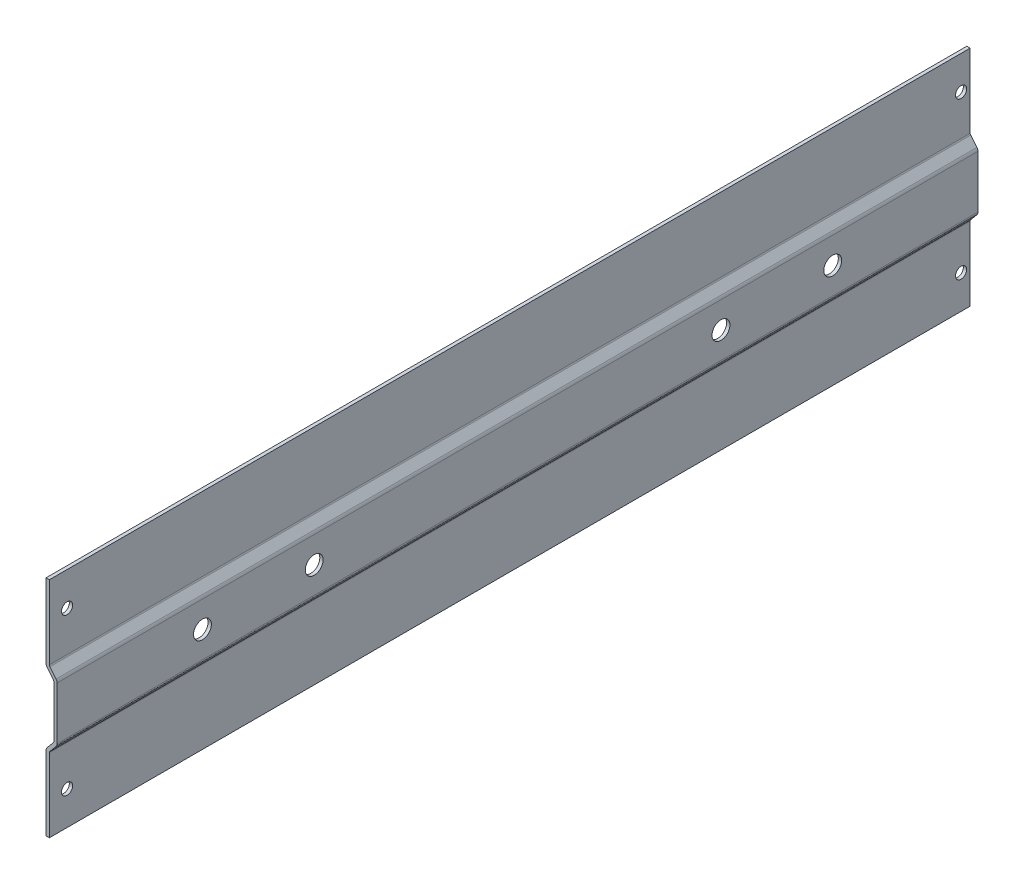
ISO-10303-21;
HEADER;
FILE_DESCRIPTION(('STEP AP214'),'2;1');
FILE_NAME('part.step','',(''),(''),'','','');
FILE_SCHEMA(('AUTOMOTIVE_DESIGN { 1 0 10303 214 1 1 1 1 }'));
ENDSEC;
DATA;
#1=APPLICATION_CONTEXT('core data for automotive mechanical design processes');
#2=APPLICATION_PROTOCOL_DEFINITION('international standard','automotive_design',2000,#1);
#3=PRODUCT_CONTEXT('',#1,'mechanical');
#4=PRODUCT('Part','Part','',(#3));
#5=PRODUCT_RELATED_PRODUCT_CATEGORY('part','',(#4));
#6=PRODUCT_DEFINITION_FORMATION('','',#4);
#7=PRODUCT_DEFINITION_CONTEXT('part definition',#1,'design');
#8=PRODUCT_DEFINITION('design','',#6,#7);
#9=PRODUCT_DEFINITION_SHAPE('','',#8);
#10=(LENGTH_UNIT() NAMED_UNIT(*) SI_UNIT(.MILLI.,.METRE.));
#11=(NAMED_UNIT(*) PLANE_ANGLE_UNIT() SI_UNIT($,.RADIAN.));
#12=(NAMED_UNIT(*) SI_UNIT($,.STERADIAN.) SOLID_ANGLE_UNIT());
#13=UNCERTAINTY_MEASURE_WITH_UNIT(LENGTH_MEASURE(1.E-05),#10,'distance_accuracy_value','');
#14=(GEOMETRIC_REPRESENTATION_CONTEXT(3) GLOBAL_UNCERTAINTY_ASSIGNED_CONTEXT((#13)) GLOBAL_UNIT_ASSIGNED_CONTEXT((#10,
#11,#12)) REPRESENTATION_CONTEXT('',''));
#15=CARTESIAN_POINT('',(0.,0.,0.));
#16=DIRECTION('',(0.,0.,1.));
#17=DIRECTION('',(1.,0.,0.));
#18=AXIS2_PLACEMENT_3D('',#15,#16,#17);
#19=CARTESIAN_POINT('',(3.,0.,824.));
#20=DIRECTION('',(0.,1.,0.));
#21=DIRECTION('',(0.,0.,1.));
#22=AXIS2_PLACEMENT_3D('',#19,#20,#21);
#23=PLANE('',#22);
#24=DIRECTION('',(1.,0.,0.));
#25=VECTOR('',#24,1.);
#26=CARTESIAN_POINT('',(3.,0.,0.));
#27=LINE('',#26,#25);
#28=CARTESIAN_POINT('',(0.,0.,0.));
#29=VERTEX_POINT('',#28);
#30=CARTESIAN_POINT('',(3.,0.,0.));
#31=VERTEX_POINT('',#30);
#32=EDGE_CURVE('E197',#29,#31,#27,.T.);
#33=ORIENTED_EDGE('',*,*,#32,.T.);
#34=DIRECTION('',(0.,0.,-1.));
#35=VECTOR('',#34,1.);
#36=CARTESIAN_POINT('',(3.,0.,824.));
#37=LINE('',#36,#35);
#38=CARTESIAN_POINT('',(3.,0.,824.));
#39=VERTEX_POINT('',#38);
#40=EDGE_CURVE('E177',#39,#31,#37,.T.);
#41=ORIENTED_EDGE('',*,*,#40,.F.);
#42=DIRECTION('',(1.,0.,0.));
#43=VECTOR('',#42,1.);
#44=CARTESIAN_POINT('',(3.,0.,824.));
#45=LINE('',#44,#43);
#46=CARTESIAN_POINT('',(0.,0.,824.));
#47=VERTEX_POINT('',#46);
#48=EDGE_CURVE('E184',#47,#39,#45,.T.);
#49=ORIENTED_EDGE('',*,*,#48,.F.);
#50=DIRECTION('',(0.,0.,-1.));
#51=VECTOR('',#50,1.);
#52=CARTESIAN_POINT('',(0.,0.,824.));
#53=LINE('',#52,#51);
#54=EDGE_CURVE('E316',#47,#29,#53,.T.);
#55=ORIENTED_EDGE('',*,*,#54,.T.);
#56=EDGE_LOOP('',(#33,#41,#49,#55));
#57=FACE_BOUND('',#56,.T.);
#58=ADVANCED_FACE('F35',(#57),#23,.F.);
#59=CARTESIAN_POINT('',(3.,66.6577248518405,824.));
#60=DIRECTION('',(-1.,0.,0.));
#61=DIRECTION('',(0.,-1.,0.));
#62=AXIS2_PLACEMENT_3D('',#59,#60,#61);
#63=PLANE('',#62);
#64=CARTESIAN_POINT('',(3.,30.,8.14000000000004));
#65=DIRECTION('',(-1.,0.,0.));
#66=DIRECTION('',(0.,-1.,0.));
#67=AXIS2_PLACEMENT_3D('',#64,#65,#66);
#68=CIRCLE('',#67,5.);
#69=CARTESIAN_POINT('',(3.,25.,8.14000000000004));
#70=VERTEX_POINT('',#69);
#71=EDGE_CURVE('E667',#70,#70,#68,.T.);
#72=ORIENTED_EDGE('',*,*,#71,.T.);
#73=EDGE_LOOP('',(#72));
#74=FACE_BOUND('',#73,.T.);
#75=CARTESIAN_POINT('',(3.,30.,808.14));
#76=DIRECTION('',(-1.,0.,0.));
#77=DIRECTION('',(0.,-1.,0.));
#78=AXIS2_PLACEMENT_3D('',#75,#76,#77);
#79=CIRCLE('',#78,5.);
#80=CARTESIAN_POINT('',(3.,25.,808.14));
#81=VERTEX_POINT('',#80);
#82=EDGE_CURVE('E682',#81,#81,#79,.T.);
#83=ORIENTED_EDGE('',*,*,#82,.T.);
#84=EDGE_LOOP('',(#83));
#85=FACE_BOUND('',#84,.T.);
#86=DIRECTION('',(0.,1.,0.));
#87=VECTOR('',#86,1.);
#88=CARTESIAN_POINT('',(3.,66.6577248518405,0.));
#89=LINE('',#88,#87);
#90=CARTESIAN_POINT('',(3.,65.9297843833081,0.));
#91=VERTEX_POINT('',#90);
#92=EDGE_CURVE('E287',#31,#91,#89,.T.);
#93=ORIENTED_EDGE('',*,*,#92,.T.);
#94=DIRECTION('',(0.,0.,-1.));
#95=VECTOR('',#94,1.);
#96=CARTESIAN_POINT('',(3.,65.9297843833081,824.));
#97=LINE('',#96,#95);
#98=CARTESIAN_POINT('',(3.,65.9297843833081,824.));
#99=VERTEX_POINT('',#98);
#100=EDGE_CURVE('E180',#91,#99,#97,.F.);
#101=ORIENTED_EDGE('',*,*,#100,.T.);
#102=DIRECTION('',(0.,1.,0.));
#103=VECTOR('',#102,1.);
#104=CARTESIAN_POINT('',(3.,66.6577248518405,824.));
#105=LINE('',#104,#103);
#106=EDGE_CURVE('E172',#39,#99,#105,.T.);
#107=ORIENTED_EDGE('',*,*,#106,.F.);
#108=ORIENTED_EDGE('',*,*,#40,.T.);
#109=EDGE_LOOP('',(#93,#101,#107,#108));
#110=FACE_BOUND('',#109,.T.);
#111=ADVANCED_FACE('F175',(#74,#85,#110),#63,.F.);
#112=CARTESIAN_POINT('',(10.,75.,824.));
#113=DIRECTION('',(-0.766044443118977,0.642787609686541,0.));
#114=DIRECTION('',(-0.642787609686541,-0.766044443118977,0.));
#115=AXIS2_PLACEMENT_3D('',#112,#113,#114);
#116=PLANE('',#115);
#117=DIRECTION('',(0.642787609686541,0.766044443118977,0.));
#118=VECTOR('',#117,1.);
#119=CARTESIAN_POINT('',(10.,75.,824.));
#120=LINE('',#119,#118);
#121=CARTESIAN_POINT('',(3.46791111376204,67.2153596026812,824.));
#122=VERTEX_POINT('',#121);
#123=CARTESIAN_POINT('',(9.06417777247592,73.8847304983186,824.));
#124=VERTEX_POINT('',#123);
#125=EDGE_CURVE('E183',#122,#124,#120,.T.);
#126=ORIENTED_EDGE('',*,*,#125,.F.);
#127=DIRECTION('',(0.,0.,-1.));
#128=VECTOR('',#127,1.);
#129=CARTESIAN_POINT('',(3.46791111376204,67.2153596026812,0.));
#130=LINE('',#129,#128);
#131=CARTESIAN_POINT('',(3.46791111376204,67.2153596026812,0.));
#132=VERTEX_POINT('',#131);
#133=EDGE_CURVE('E255',#122,#132,#130,.T.);
#134=ORIENTED_EDGE('',*,*,#133,.T.);
#135=DIRECTION('',(0.642787609686541,0.766044443118977,0.));
#136=VECTOR('',#135,1.);
#137=CARTESIAN_POINT('',(10.,75.,0.));
#138=LINE('',#137,#136);
#139=CARTESIAN_POINT('',(9.06417777247592,73.8847304983186,0.));
#140=VERTEX_POINT('',#139);
#141=EDGE_CURVE('E288',#132,#140,#138,.T.);
#142=ORIENTED_EDGE('',*,*,#141,.T.);
#143=DIRECTION('',(0.,0.,-1.));
#144=VECTOR('',#143,1.);
#145=CARTESIAN_POINT('',(9.06417777247592,73.8847304983186,824.));
#146=LINE('',#145,#144);
#147=EDGE_CURVE('E239',#140,#124,#146,.F.);
#148=ORIENTED_EDGE('',*,*,#147,.T.);
#149=EDGE_LOOP('',(#126,#134,#142,#148));
#150=FACE_BOUND('',#149,.T.);
#151=ADVANCED_FACE('F278',(#150),#116,.F.);
#152=CARTESIAN_POINT('',(10.,125.,824.));
#153=DIRECTION('',(-1.,0.,0.));
#154=DIRECTION('',(0.,-1.,0.));
#155=AXIS2_PLACEMENT_3D('',#152,#153,#154);
#156=PLANE('',#155);
#157=CARTESIAN_POINT('',(10.,100.,694.));
#158=DIRECTION('',(1.,0.,0.));
#159=DIRECTION('',(0.,0.,-1.));
#160=AXIS2_PLACEMENT_3D('',#157,#158,#159);
#161=CIRCLE('',#160,7.99999999999999);
#162=CARTESIAN_POINT('',(10.,100.,686.));
#163=VERTEX_POINT('',#162);
#164=EDGE_CURVE('E685',#163,#163,#161,.T.);
#165=ORIENTED_EDGE('',*,*,#164,.F.);
#166=EDGE_LOOP('',(#165));
#167=FACE_BOUND('',#166,.T.);
#168=CARTESIAN_POINT('',(10.,100.,130.));
#169=DIRECTION('',(1.,0.,0.));
#170=DIRECTION('',(0.,0.,-1.));
#171=AXIS2_PLACEMENT_3D('',#168,#169,#170);
#172=CIRCLE('',#171,7.99999999999999);
#173=CARTESIAN_POINT('',(10.,100.,122.));
#174=VERTEX_POINT('',#173);
#175=EDGE_CURVE('E691',#174,#174,#172,.T.);
#176=ORIENTED_EDGE('',*,*,#175,.F.);
#177=EDGE_LOOP('',(#176));
#178=FACE_BOUND('',#177,.T.);
#179=CARTESIAN_POINT('',(10.,100.,594.));
#180=DIRECTION('',(1.,0.,0.));
#181=DIRECTION('',(0.,0.,-1.));
#182=AXIS2_PLACEMENT_3D('',#179,#180,#181);
#183=CIRCLE('',#182,7.99999999999999);
#184=CARTESIAN_POINT('',(10.,100.,586.));
#185=VERTEX_POINT('',#184);
#186=EDGE_CURVE('E697',#185,#185,#183,.T.);
#187=ORIENTED_EDGE('',*,*,#186,.F.);
#188=EDGE_LOOP('',(#187));
#189=FACE_BOUND('',#188,.T.);
#190=CARTESIAN_POINT('',(10.,100.,230.));
#191=DIRECTION('',(1.,0.,0.));
#192=DIRECTION('',(0.,0.,-1.));
#193=AXIS2_PLACEMENT_3D('',#190,#191,#192);
#194=CIRCLE('',#193,7.99999999999999);
#195=CARTESIAN_POINT('',(10.,100.,222.));
#196=VERTEX_POINT('',#195);
#197=EDGE_CURVE('E703',#196,#196,#194,.T.);
#198=ORIENTED_EDGE('',*,*,#197,.F.);
#199=EDGE_LOOP('',(#198));
#200=FACE_BOUND('',#199,.T.);
#201=DIRECTION('',(0.,1.,0.));
#202=VECTOR('',#201,1.);
#203=CARTESIAN_POINT('',(10.,125.,824.));
#204=LINE('',#203,#202);
#205=CARTESIAN_POINT('',(10.,76.4558809370648,824.));
#206=VERTEX_POINT('',#205);
#207=CARTESIAN_POINT('',(10.,123.544119062935,824.));
#208=VERTEX_POINT('',#207);
#209=EDGE_CURVE('E282',#206,#208,#204,.T.);
#210=ORIENTED_EDGE('',*,*,#209,.F.);
#211=DIRECTION('',(0.,0.,-1.));
#212=VECTOR('',#211,1.);
#213=CARTESIAN_POINT('',(10.,76.4558809370648,824.));
#214=LINE('',#213,#212);
#215=CARTESIAN_POINT('',(10.,76.4558809370648,0.));
#216=VERTEX_POINT('',#215);
#217=EDGE_CURVE('E236',#206,#216,#214,.T.);
#218=ORIENTED_EDGE('',*,*,#217,.T.);
#219=DIRECTION('',(0.,1.,0.));
#220=VECTOR('',#219,1.);
#221=CARTESIAN_POINT('',(10.,125.,0.));
#222=LINE('',#221,#220);
#223=CARTESIAN_POINT('',(10.,123.544119062935,0.));
#224=VERTEX_POINT('',#223);
#225=EDGE_CURVE('E290',#216,#224,#222,.T.);
#226=ORIENTED_EDGE('',*,*,#225,.T.);
#227=DIRECTION('',(0.,0.,-1.));
#228=VECTOR('',#227,1.);
#229=CARTESIAN_POINT('',(10.,123.544119062935,824.));
#230=LINE('',#229,#228);
#231=EDGE_CURVE('E234',#224,#208,#230,.F.);
#232=ORIENTED_EDGE('',*,*,#231,.T.);
#233=EDGE_LOOP('',(#210,#218,#226,#232));
#234=FACE_BOUND('',#233,.T.);
#235=ADVANCED_FACE('F405',(#167,#178,#189,#200,#234),#156,.F.);
#236=CARTESIAN_POINT('',(2.99999999999999,133.342275148159,824.));
#237=DIRECTION('',(-0.766044443118977,-0.64278760968654,0.));
#238=DIRECTION('',(0.64278760968654,-0.766044443118977,0.));
#239=AXIS2_PLACEMENT_3D('',#236,#237,#238);
#240=PLANE('',#239);
#241=DIRECTION('',(-0.64278760968654,0.766044443118977,0.));
#242=VECTOR('',#241,1.);
#243=CARTESIAN_POINT('',(2.99999999999999,133.342275148159,0.));
#244=LINE('',#243,#242);
#245=CARTESIAN_POINT('',(9.06417777247592,126.115269501681,0.));
#246=VERTEX_POINT('',#245);
#247=CARTESIAN_POINT('',(3.46791111376205,132.784640397319,0.));
#248=VERTEX_POINT('',#247);
#249=EDGE_CURVE('E298',#246,#248,#244,.T.);
#250=ORIENTED_EDGE('',*,*,#249,.T.);
#251=DIRECTION('',(0.,0.,-1.));
#252=VECTOR('',#251,1.);
#253=CARTESIAN_POINT('',(3.46791111376205,132.784640397319,824.));
#254=LINE('',#253,#252);
#255=CARTESIAN_POINT('',(3.46791111376205,132.784640397319,824.));
#256=VERTEX_POINT('',#255);
#257=EDGE_CURVE('E56',#248,#256,#254,.F.);
#258=ORIENTED_EDGE('',*,*,#257,.T.);
#259=DIRECTION('',(-0.64278760968654,0.766044443118977,0.));
#260=VECTOR('',#259,1.);
#261=CARTESIAN_POINT('',(2.99999999999999,133.342275148159,824.));
#262=LINE('',#261,#260);
#263=CARTESIAN_POINT('',(9.06417777247592,126.115269501681,824.));
#264=VERTEX_POINT('',#263);
#265=EDGE_CURVE('E408',#264,#256,#262,.T.);
#266=ORIENTED_EDGE('',*,*,#265,.F.);
#267=DIRECTION('',(0.,0.,-1.));
#268=VECTOR('',#267,1.);
#269=CARTESIAN_POINT('',(9.06417777247592,126.115269501681,824.));
#270=LINE('',#269,#268);
#271=EDGE_CURVE('E242',#264,#246,#270,.T.);
#272=ORIENTED_EDGE('',*,*,#271,.T.);
#273=EDGE_LOOP('',(#250,#258,#266,#272));
#274=FACE_BOUND('',#273,.T.);
#275=ADVANCED_FACE('F422',(#274),#240,.F.);
#276=CARTESIAN_POINT('',(2.99999999999998,200.,824.));
#277=DIRECTION('',(-1.,0.,0.));
#278=DIRECTION('',(0.,-1.,0.));
#279=AXIS2_PLACEMENT_3D('',#276,#277,#278);
#280=PLANE('',#279);
#281=CARTESIAN_POINT('',(2.99999999999998,170.,8.14000000000004));
#282=DIRECTION('',(-1.,0.,0.));
#283=DIRECTION('',(0.,-1.,0.));
#284=AXIS2_PLACEMENT_3D('',#281,#282,#283);
#285=CIRCLE('',#284,5.);
#286=CARTESIAN_POINT('',(2.99999999999999,165.,8.14000000000004));
#287=VERTEX_POINT('',#286);
#288=EDGE_CURVE('E663',#287,#287,#285,.T.);
#289=ORIENTED_EDGE('',*,*,#288,.T.);
#290=EDGE_LOOP('',(#289));
#291=FACE_BOUND('',#290,.T.);
#292=CARTESIAN_POINT('',(2.99999999999998,170.,808.14));
#293=DIRECTION('',(-1.,0.,0.));
#294=DIRECTION('',(0.,-1.,0.));
#295=AXIS2_PLACEMENT_3D('',#292,#293,#294);
#296=CIRCLE('',#295,5.);
#297=CARTESIAN_POINT('',(2.99999999999999,165.,808.14));
#298=VERTEX_POINT('',#297);
#299=EDGE_CURVE('E676',#298,#298,#296,.T.);
#300=ORIENTED_EDGE('',*,*,#299,.T.);
#301=EDGE_LOOP('',(#300));
#302=FACE_BOUND('',#301,.T.);
#303=DIRECTION('',(0.,1.,0.));
#304=VECTOR('',#303,1.);
#305=CARTESIAN_POINT('',(2.99999999999998,200.,824.));
#306=LINE('',#305,#304);
#307=CARTESIAN_POINT('',(2.99999999999999,134.070215616692,824.));
#308=VERTEX_POINT('',#307);
#309=CARTESIAN_POINT('',(2.99999999999998,200.,824.));
#310=VERTEX_POINT('',#309);
#311=EDGE_CURVE('E410',#308,#310,#306,.T.);
#312=ORIENTED_EDGE('',*,*,#311,.F.);
#313=DIRECTION('',(0.,0.,-1.));
#314=VECTOR('',#313,1.);
#315=CARTESIAN_POINT('',(2.99999999999999,134.070215616692,0.));
#316=LINE('',#315,#314);
#317=CARTESIAN_POINT('',(2.99999999999999,134.070215616692,0.));
#318=VERTEX_POINT('',#317);
#319=EDGE_CURVE('E259',#308,#318,#316,.T.);
#320=ORIENTED_EDGE('',*,*,#319,.T.);
#321=DIRECTION('',(0.,1.,0.));
#322=VECTOR('',#321,1.);
#323=CARTESIAN_POINT('',(2.99999999999998,200.,0.));
#324=LINE('',#323,#322);
#325=CARTESIAN_POINT('',(2.99999999999998,200.,0.));
#326=VERTEX_POINT('',#325);
#327=EDGE_CURVE('E300',#318,#326,#324,.T.);
#328=ORIENTED_EDGE('',*,*,#327,.T.);
#329=DIRECTION('',(0.,0.,-1.));
#330=VECTOR('',#329,1.);
#331=CARTESIAN_POINT('',(2.99999999999998,200.,824.));
#332=LINE('',#331,#330);
#333=EDGE_CURVE('E199',#310,#326,#332,.T.);
#334=ORIENTED_EDGE('',*,*,#333,.F.);
#335=EDGE_LOOP('',(#312,#320,#328,#334));
#336=FACE_BOUND('',#335,.T.);
#337=ADVANCED_FACE('F417',(#291,#302,#336),#280,.F.);
#338=CARTESIAN_POINT('',(0.,200.,824.));
#339=DIRECTION('',(0.,-1.,0.));
#340=DIRECTION('',(0.,0.,-1.));
#341=AXIS2_PLACEMENT_3D('',#338,#339,#340);
#342=PLANE('',#341);
#343=DIRECTION('',(-1.,0.,0.));
#344=VECTOR('',#343,1.);
#345=CARTESIAN_POINT('',(0.,200.,0.));
#346=LINE('',#345,#344);
#347=CARTESIAN_POINT('',(0.,200.,0.));
#348=VERTEX_POINT('',#347);
#349=EDGE_CURVE('E302',#326,#348,#346,.T.);
#350=ORIENTED_EDGE('',*,*,#349,.T.);
#351=DIRECTION('',(0.,0.,-1.));
#352=VECTOR('',#351,1.);
#353=CARTESIAN_POINT('',(0.,200.,824.));
#354=LINE('',#353,#352);
#355=CARTESIAN_POINT('',(0.,200.,824.));
#356=VERTEX_POINT('',#355);
#357=EDGE_CURVE('E205',#356,#348,#354,.T.);
#358=ORIENTED_EDGE('',*,*,#357,.F.);
#359=DIRECTION('',(-1.,0.,0.));
#360=VECTOR('',#359,1.);
#361=CARTESIAN_POINT('',(0.,200.,824.));
#362=LINE('',#361,#360);
#363=EDGE_CURVE('E345',#310,#356,#362,.T.);
#364=ORIENTED_EDGE('',*,*,#363,.F.);
#365=ORIENTED_EDGE('',*,*,#333,.T.);
#366=EDGE_LOOP('',(#350,#358,#364,#365));
#367=FACE_BOUND('',#366,.T.);
#368=ADVANCED_FACE('F415',(#367),#342,.F.);
#369=CARTESIAN_POINT('',(0.,132.250364445361,824.));
#370=DIRECTION('',(1.,0.,0.));
#371=DIRECTION('',(0.,1.,0.));
#372=AXIS2_PLACEMENT_3D('',#369,#370,#371);
#373=PLANE('',#372);
#374=CARTESIAN_POINT('',(-1.22225826823356E-13,170.,8.14000000000004));
#375=DIRECTION('',(-1.,0.,0.));
#376=DIRECTION('',(0.,0.,1.));
#377=AXIS2_PLACEMENT_3D('',#374,#375,#376);
#378=CIRCLE('',#377,5.);
#379=CARTESIAN_POINT('',(-1.22225826823356E-13,170.,13.14));
#380=VERTEX_POINT('',#379);
#381=EDGE_CURVE('E660',#380,#380,#378,.T.);
#382=ORIENTED_EDGE('',*,*,#381,.F.);
#383=EDGE_LOOP('',(#382));
#384=FACE_BOUND('',#383,.T.);
#385=CARTESIAN_POINT('',(-1.22225826823356E-13,170.,808.14));
#386=DIRECTION('',(-1.,0.,0.));
#387=DIRECTION('',(0.,0.,1.));
#388=AXIS2_PLACEMENT_3D('',#385,#386,#387);
#389=CIRCLE('',#388,5.);
#390=CARTESIAN_POINT('',(-1.22225826823356E-13,170.,813.14));
#391=VERTEX_POINT('',#390);
#392=EDGE_CURVE('E673',#391,#391,#389,.T.);
#393=ORIENTED_EDGE('',*,*,#392,.F.);
#394=EDGE_LOOP('',(#393));
#395=FACE_BOUND('',#394,.T.);
#396=DIRECTION('',(0.,-1.,0.));
#397=VECTOR('',#396,1.);
#398=CARTESIAN_POINT('',(0.,132.250364445361,0.));
#399=LINE('',#398,#397);
#400=CARTESIAN_POINT('',(0.,133.706245382426,0.));
#401=VERTEX_POINT('',#400);
#402=EDGE_CURVE('E304',#348,#401,#399,.T.);
#403=ORIENTED_EDGE('',*,*,#402,.T.);
#404=DIRECTION('',(0.,0.,-1.));
#405=VECTOR('',#404,1.);
#406=CARTESIAN_POINT('',(0.,133.706245382426,824.));
#407=LINE('',#406,#405);
#408=CARTESIAN_POINT('',(0.,133.706245382426,824.));
#409=VERTEX_POINT('',#408);
#410=EDGE_CURVE('E232',#401,#409,#407,.F.);
#411=ORIENTED_EDGE('',*,*,#410,.T.);
#412=DIRECTION('',(0.,-1.,0.));
#413=VECTOR('',#412,1.);
#414=CARTESIAN_POINT('',(0.,132.250364445361,824.));
#415=LINE('',#414,#413);
#416=EDGE_CURVE('E325',#356,#409,#415,.T.);
#417=ORIENTED_EDGE('',*,*,#416,.F.);
#418=ORIENTED_EDGE('',*,*,#357,.T.);
#419=EDGE_LOOP('',(#403,#411,#417,#418));
#420=FACE_BOUND('',#419,.T.);
#421=ADVANCED_FACE('F322',(#384,#395,#420),#373,.F.);
#422=CARTESIAN_POINT('',(7.00000000000002,123.908089297201,824.));
#423=DIRECTION('',(0.766044443118976,0.642787609686541,0.));
#424=DIRECTION('',(-0.642787609686541,0.766044443118977,0.));
#425=AXIS2_PLACEMENT_3D('',#422,#423,#424);
#426=PLANE('',#425);
#427=DIRECTION('',(0.642787609686541,-0.766044443118977,0.));
#428=VECTOR('',#427,1.);
#429=CARTESIAN_POINT('',(7.00000000000002,123.908089297201,0.));
#430=LINE('',#429,#428);
#431=CARTESIAN_POINT('',(0.935822227524091,131.135094943679,0.));
#432=VERTEX_POINT('',#431);
#433=CARTESIAN_POINT('',(6.53208888623796,124.465724048042,0.));
#434=VERTEX_POINT('',#433);
#435=EDGE_CURVE('E307',#432,#434,#430,.T.);
#436=ORIENTED_EDGE('',*,*,#435,.T.);
#437=DIRECTION('',(0.,0.,-1.));
#438=VECTOR('',#437,1.);
#439=CARTESIAN_POINT('',(6.53208888623796,124.465724048042,824.));
#440=LINE('',#439,#438);
#441=CARTESIAN_POINT('',(6.53208888623796,124.465724048042,824.));
#442=VERTEX_POINT('',#441);
#443=EDGE_CURVE('E253',#434,#442,#440,.F.);
#444=ORIENTED_EDGE('',*,*,#443,.T.);
#445=DIRECTION('',(0.642787609686541,-0.766044443118977,0.));
#446=VECTOR('',#445,1.);
#447=CARTESIAN_POINT('',(7.00000000000002,123.908089297201,824.));
#448=LINE('',#447,#446);
#449=CARTESIAN_POINT('',(0.935822227524091,131.135094943679,824.));
#450=VERTEX_POINT('',#449);
#451=EDGE_CURVE('E339',#450,#442,#448,.T.);
#452=ORIENTED_EDGE('',*,*,#451,.F.);
#453=DIRECTION('',(0.,0.,-1.));
#454=VECTOR('',#453,1.);
#455=CARTESIAN_POINT('',(0.935822227524091,131.135094943679,824.));
#456=LINE('',#455,#454);
#457=EDGE_CURVE('E229',#450,#432,#456,.T.);
#458=ORIENTED_EDGE('',*,*,#457,.T.);
#459=EDGE_LOOP('',(#436,#444,#452,#458));
#460=FACE_BOUND('',#459,.T.);
#461=ADVANCED_FACE('F336',(#460),#426,.F.);
#462=CARTESIAN_POINT('',(7.00000000000001,76.0919107027986,824.));
#463=DIRECTION('',(1.,0.,0.));
#464=DIRECTION('',(0.,1.,0.));
#465=AXIS2_PLACEMENT_3D('',#462,#463,#464);
#466=PLANE('',#465);
#467=CARTESIAN_POINT('',(7.00000000000001,100.,694.));
#468=DIRECTION('',(1.,0.,0.));
#469=DIRECTION('',(0.,1.,0.));
#470=AXIS2_PLACEMENT_3D('',#467,#468,#469);
#471=CIRCLE('',#470,7.99999999999999);
#472=CARTESIAN_POINT('',(7.00000000000001,108.,694.));
#473=VERTEX_POINT('',#472);
#474=EDGE_CURVE('E688',#473,#473,#471,.T.);
#475=ORIENTED_EDGE('',*,*,#474,.T.);
#476=EDGE_LOOP('',(#475));
#477=FACE_BOUND('',#476,.T.);
#478=CARTESIAN_POINT('',(7.00000000000001,100.,130.));
#479=DIRECTION('',(1.,0.,0.));
#480=DIRECTION('',(0.,1.,0.));
#481=AXIS2_PLACEMENT_3D('',#478,#479,#480);
#482=CIRCLE('',#481,7.99999999999999);
#483=CARTESIAN_POINT('',(7.00000000000001,108.,130.));
#484=VERTEX_POINT('',#483);
#485=EDGE_CURVE('E694',#484,#484,#482,.T.);
#486=ORIENTED_EDGE('',*,*,#485,.T.);
#487=EDGE_LOOP('',(#486));
#488=FACE_BOUND('',#487,.T.);
#489=CARTESIAN_POINT('',(7.00000000000001,100.,594.));
#490=DIRECTION('',(1.,0.,0.));
#491=DIRECTION('',(0.,1.,0.));
#492=AXIS2_PLACEMENT_3D('',#489,#490,#491);
#493=CIRCLE('',#492,7.99999999999999);
#494=CARTESIAN_POINT('',(7.00000000000001,108.,594.));
#495=VERTEX_POINT('',#494);
#496=EDGE_CURVE('E700',#495,#495,#493,.T.);
#497=ORIENTED_EDGE('',*,*,#496,.T.);
#498=EDGE_LOOP('',(#497));
#499=FACE_BOUND('',#498,.T.);
#500=CARTESIAN_POINT('',(7.00000000000001,100.,230.));
#501=DIRECTION('',(1.,0.,0.));
#502=DIRECTION('',(0.,1.,0.));
#503=AXIS2_PLACEMENT_3D('',#500,#501,#502);
#504=CIRCLE('',#503,7.99999999999999);
#505=CARTESIAN_POINT('',(7.00000000000001,108.,230.));
#506=VERTEX_POINT('',#505);
#507=EDGE_CURVE('E292',#506,#506,#504,.T.);
#508=ORIENTED_EDGE('',*,*,#507,.T.);
#509=EDGE_LOOP('',(#508));
#510=FACE_BOUND('',#509,.T.);
#511=DIRECTION('',(0.,-1.,0.));
#512=VECTOR('',#511,1.);
#513=CARTESIAN_POINT('',(7.00000000000001,76.0919107027986,0.));
#514=LINE('',#513,#512);
#515=CARTESIAN_POINT('',(7.00000000000002,123.180148828669,0.));
#516=VERTEX_POINT('',#515);
#517=CARTESIAN_POINT('',(7.00000000000001,76.819851171331,0.));
#518=VERTEX_POINT('',#517);
#519=EDGE_CURVE('E310',#516,#518,#514,.T.);
#520=ORIENTED_EDGE('',*,*,#519,.T.);
#521=DIRECTION('',(0.,0.,-1.));
#522=VECTOR('',#521,1.);
#523=CARTESIAN_POINT('',(7.00000000000001,76.819851171331,824.));
#524=LINE('',#523,#522);
#525=CARTESIAN_POINT('',(7.00000000000001,76.819851171331,824.));
#526=VERTEX_POINT('',#525);
#527=EDGE_CURVE('E251',#518,#526,#524,.F.);
#528=ORIENTED_EDGE('',*,*,#527,.T.);
#529=DIRECTION('',(0.,-1.,0.));
#530=VECTOR('',#529,1.);
#531=CARTESIAN_POINT('',(7.00000000000001,76.0919107027986,824.));
#532=LINE('',#531,#530);
#533=CARTESIAN_POINT('',(7.00000000000002,123.180148828669,824.));
#534=VERTEX_POINT('',#533);
#535=EDGE_CURVE('E341',#534,#526,#532,.T.);
#536=ORIENTED_EDGE('',*,*,#535,.F.);
#537=DIRECTION('',(0.,0.,-1.));
#538=VECTOR('',#537,1.);
#539=CARTESIAN_POINT('',(7.00000000000002,123.180148828669,2.22044604925031E-13));
#540=LINE('',#539,#538);
#541=EDGE_CURVE('E248',#534,#516,#540,.T.);
#542=ORIENTED_EDGE('',*,*,#541,.T.);
#543=EDGE_LOOP('',(#520,#528,#536,#542));
#544=FACE_BOUND('',#543,.T.);
#545=ADVANCED_FACE('F366',(#477,#488,#499,#510,#544),#466,.F.);
#546=CARTESIAN_POINT('',(0.,67.7496355546391,824.));
#547=DIRECTION('',(0.766044443118977,-0.64278760968654,0.));
#548=DIRECTION('',(0.64278760968654,0.766044443118977,0.));
#549=AXIS2_PLACEMENT_3D('',#546,#547,#548);
#550=PLANE('',#549);
#551=DIRECTION('',(-0.64278760968654,-0.766044443118977,0.));
#552=VECTOR('',#551,1.);
#553=CARTESIAN_POINT('',(0.,67.7496355546391,824.));
#554=LINE('',#553,#552);
#555=CARTESIAN_POINT('',(6.53208888623797,75.5342759519579,824.));
#556=VERTEX_POINT('',#555);
#557=CARTESIAN_POINT('',(0.935822227524093,68.8649050563205,824.));
#558=VERTEX_POINT('',#557);
#559=EDGE_CURVE('E343',#556,#558,#554,.T.);
#560=ORIENTED_EDGE('',*,*,#559,.F.);
#561=DIRECTION('',(0.,0.,-1.));
#562=VECTOR('',#561,1.);
#563=CARTESIAN_POINT('',(6.53208888623797,75.5342759519579,0.));
#564=LINE('',#563,#562);
#565=CARTESIAN_POINT('',(6.53208888623797,75.5342759519579,0.));
#566=VERTEX_POINT('',#565);
#567=EDGE_CURVE('E245',#556,#566,#564,.T.);
#568=ORIENTED_EDGE('',*,*,#567,.T.);
#569=DIRECTION('',(-0.64278760968654,-0.766044443118977,0.));
#570=VECTOR('',#569,1.);
#571=CARTESIAN_POINT('',(0.,67.7496355546391,0.));
#572=LINE('',#571,#570);
#573=CARTESIAN_POINT('',(0.935822227524093,68.8649050563205,0.));
#574=VERTEX_POINT('',#573);
#575=EDGE_CURVE('E313',#566,#574,#572,.T.);
#576=ORIENTED_EDGE('',*,*,#575,.T.);
#577=DIRECTION('',(0.,0.,-1.));
#578=VECTOR('',#577,1.);
#579=CARTESIAN_POINT('',(0.935822227524093,68.8649050563205,824.));
#580=LINE('',#579,#578);
#581=EDGE_CURVE('E218',#574,#558,#580,.F.);
#582=ORIENTED_EDGE('',*,*,#581,.T.);
#583=EDGE_LOOP('',(#560,#568,#576,#582));
#584=FACE_BOUND('',#583,.T.);
#585=ADVANCED_FACE('F355',(#584),#550,.F.);
#586=CARTESIAN_POINT('',(0.,0.,824.));
#587=DIRECTION('',(1.,0.,0.));
#588=DIRECTION('',(0.,0.,-1.));
#589=AXIS2_PLACEMENT_3D('',#586,#587,#588);
#590=PLANE('',#589);
#591=CARTESIAN_POINT('',(0.,30.,8.14000000000004));
#592=DIRECTION('',(-1.,0.,0.));
#593=DIRECTION('',(0.,0.,1.));
#594=AXIS2_PLACEMENT_3D('',#591,#592,#593);
#595=CIRCLE('',#594,5.);
#596=CARTESIAN_POINT('',(0.,30.,13.14));
#597=VERTEX_POINT('',#596);
#598=EDGE_CURVE('E664',#597,#597,#595,.T.);
#599=ORIENTED_EDGE('',*,*,#598,.F.);
#600=EDGE_LOOP('',(#599));
#601=FACE_BOUND('',#600,.T.);
#602=CARTESIAN_POINT('',(0.,30.,808.14));
#603=DIRECTION('',(-1.,0.,0.));
#604=DIRECTION('',(0.,0.,1.));
#605=AXIS2_PLACEMENT_3D('',#602,#603,#604);
#606=CIRCLE('',#605,5.);
#607=CARTESIAN_POINT('',(0.,30.,813.14));
#608=VERTEX_POINT('',#607);
#609=EDGE_CURVE('E679',#608,#608,#606,.T.);
#610=ORIENTED_EDGE('',*,*,#609,.F.);
#611=EDGE_LOOP('',(#610));
#612=FACE_BOUND('',#611,.T.);
#613=DIRECTION('',(0.,-1.,0.));
#614=VECTOR('',#613,1.);
#615=CARTESIAN_POINT('',(0.,0.,824.));
#616=LINE('',#615,#614);
#617=CARTESIAN_POINT('',(0.,66.2937546175743,824.));
#618=VERTEX_POINT('',#617);
#619=EDGE_CURVE('E190',#618,#47,#616,.T.);
#620=ORIENTED_EDGE('',*,*,#619,.F.);
#621=DIRECTION('',(0.,0.,-1.));
#622=VECTOR('',#621,1.);
#623=CARTESIAN_POINT('',(0.,66.2937546175743,824.));
#624=LINE('',#623,#622);
#625=CARTESIAN_POINT('',(0.,66.2937546175743,0.));
#626=VERTEX_POINT('',#625);
#627=EDGE_CURVE('E198',#618,#626,#624,.T.);
#628=ORIENTED_EDGE('',*,*,#627,.T.);
#629=DIRECTION('',(0.,-1.,0.));
#630=VECTOR('',#629,1.);
#631=CARTESIAN_POINT('',(0.,0.,0.));
#632=LINE('',#631,#630);
#633=EDGE_CURVE('E194',#626,#29,#632,.T.);
#634=ORIENTED_EDGE('',*,*,#633,.T.);
#635=ORIENTED_EDGE('',*,*,#54,.F.);
#636=EDGE_LOOP('',(#620,#628,#634,#635));
#637=FACE_BOUND('',#636,.T.);
#638=ADVANCED_FACE('F361',(#601,#612,#637),#590,.F.);
#639=CARTESIAN_POINT('',(0.,0.,824.));
#640=DIRECTION('',(0.,0.,-1.));
#641=DIRECTION('',(-1.,0.,0.));
#642=AXIS2_PLACEMENT_3D('',#639,#640,#641);
#643=PLANE('',#642);
#644=ORIENTED_EDGE('',*,*,#535,.T.);
#645=CARTESIAN_POINT('',(5.00000000000001,76.819851171331,824.));
#646=DIRECTION('',(0.,0.,-1.));
#647=DIRECTION('',(-1.,0.,0.));
#648=AXIS2_PLACEMENT_3D('',#645,#646,#647);
#649=CIRCLE('',#648,2.);
#650=EDGE_CURVE('E265',#526,#556,#649,.T.);
#651=ORIENTED_EDGE('',*,*,#650,.T.);
#652=ORIENTED_EDGE('',*,*,#559,.T.);
#653=CARTESIAN_POINT('',(4.,66.2937546175743,824.));
#654=DIRECTION('',(0.,0.,-1.));
#655=DIRECTION('',(-1.,0.,0.));
#656=AXIS2_PLACEMENT_3D('',#653,#654,#655);
#657=CIRCLE('',#656,4.);
#658=EDGE_CURVE('E227',#558,#618,#657,.F.);
#659=ORIENTED_EDGE('',*,*,#658,.T.);
#660=ORIENTED_EDGE('',*,*,#619,.T.);
#661=ORIENTED_EDGE('',*,*,#48,.T.);
#662=ORIENTED_EDGE('',*,*,#106,.T.);
#663=CARTESIAN_POINT('',(5.,65.9297843833081,824.));
#664=DIRECTION('',(0.,0.,-1.));
#665=DIRECTION('',(-1.,0.,0.));
#666=AXIS2_PLACEMENT_3D('',#663,#664,#665);
#667=CIRCLE('',#666,2.);
#668=EDGE_CURVE('E273',#99,#122,#667,.T.);
#669=ORIENTED_EDGE('',*,*,#668,.T.);
#670=ORIENTED_EDGE('',*,*,#125,.T.);
#671=CARTESIAN_POINT('',(6.00000000000001,76.4558809370648,824.));
#672=DIRECTION('',(0.,0.,-1.));
#673=DIRECTION('',(-1.,0.,0.));
#674=AXIS2_PLACEMENT_3D('',#671,#672,#673);
#675=CIRCLE('',#674,4.);
#676=EDGE_CURVE('E223',#124,#206,#675,.F.);
#677=ORIENTED_EDGE('',*,*,#676,.T.);
#678=ORIENTED_EDGE('',*,*,#209,.T.);
#679=CARTESIAN_POINT('',(6.00000000000001,123.544119062935,824.));
#680=DIRECTION('',(0.,0.,-1.));
#681=DIRECTION('',(-1.,0.,0.));
#682=AXIS2_PLACEMENT_3D('',#679,#680,#681);
#683=CIRCLE('',#682,4.);
#684=EDGE_CURVE('E221',#208,#264,#683,.F.);
#685=ORIENTED_EDGE('',*,*,#684,.T.);
#686=ORIENTED_EDGE('',*,*,#265,.T.);
#687=CARTESIAN_POINT('',(4.99999999999999,134.070215616692,824.));
#688=DIRECTION('',(0.,0.,-1.));
#689=DIRECTION('',(-1.,0.,0.));
#690=AXIS2_PLACEMENT_3D('',#687,#688,#689);
#691=CIRCLE('',#690,2.);
#692=EDGE_CURVE('E11',#256,#308,#691,.T.);
#693=ORIENTED_EDGE('',*,*,#692,.T.);
#694=ORIENTED_EDGE('',*,*,#311,.T.);
#695=ORIENTED_EDGE('',*,*,#363,.T.);
#696=ORIENTED_EDGE('',*,*,#416,.T.);
#697=CARTESIAN_POINT('',(4.00000000000001,133.706245382426,824.));
#698=DIRECTION('',(0.,0.,-1.));
#699=DIRECTION('',(-1.,0.,0.));
#700=AXIS2_PLACEMENT_3D('',#697,#698,#699);
#701=CIRCLE('',#700,4.);
#702=EDGE_CURVE('E225',#409,#450,#701,.F.);
#703=ORIENTED_EDGE('',*,*,#702,.T.);
#704=ORIENTED_EDGE('',*,*,#451,.T.);
#705=CARTESIAN_POINT('',(5.00000000000002,123.180148828669,824.));
#706=DIRECTION('',(0.,0.,-1.));
#707=DIRECTION('',(-1.,0.,0.));
#708=AXIS2_PLACEMENT_3D('',#705,#706,#707);
#709=CIRCLE('',#708,2.);
#710=EDGE_CURVE('E269',#442,#534,#709,.T.);
#711=ORIENTED_EDGE('',*,*,#710,.T.);
#712=EDGE_LOOP('',(#644,#651,#652,#659,#660,#661,#662,#669,#670,#677,#678,#685,#686,#693,#694,
#695,#696,#703,#704,#711));
#713=FACE_BOUND('',#712,.T.);
#714=ADVANCED_FACE('F188',(#713),#643,.F.);
#715=CARTESIAN_POINT('',(0.,0.,0.));
#716=DIRECTION('',(0.,0.,-1.));
#717=DIRECTION('',(-1.,0.,0.));
#718=AXIS2_PLACEMENT_3D('',#715,#716,#717);
#719=PLANE('',#718);
#720=ORIENTED_EDGE('',*,*,#633,.F.);
#721=CARTESIAN_POINT('',(4.,66.2937546175743,0.));
#722=DIRECTION('',(0.,0.,-1.));
#723=DIRECTION('',(-1.,0.,0.));
#724=AXIS2_PLACEMENT_3D('',#721,#722,#723);
#725=CIRCLE('',#724,4.);
#726=EDGE_CURVE('E215',#626,#574,#725,.T.);
#727=ORIENTED_EDGE('',*,*,#726,.T.);
#728=ORIENTED_EDGE('',*,*,#575,.F.);
#729=CARTESIAN_POINT('',(5.00000000000001,76.819851171331,0.));
#730=DIRECTION('',(0.,0.,-1.));
#731=DIRECTION('',(-1.,0.,0.));
#732=AXIS2_PLACEMENT_3D('',#729,#730,#731);
#733=CIRCLE('',#732,2.);
#734=EDGE_CURVE('E263',#566,#518,#733,.F.);
#735=ORIENTED_EDGE('',*,*,#734,.T.);
#736=ORIENTED_EDGE('',*,*,#519,.F.);
#737=CARTESIAN_POINT('',(5.00000000000002,123.180148828669,0.));
#738=DIRECTION('',(0.,0.,-1.));
#739=DIRECTION('',(-1.,0.,0.));
#740=AXIS2_PLACEMENT_3D('',#737,#738,#739);
#741=CIRCLE('',#740,2.);
#742=EDGE_CURVE('E267',#516,#434,#741,.F.);
#743=ORIENTED_EDGE('',*,*,#742,.T.);
#744=ORIENTED_EDGE('',*,*,#435,.F.);
#745=CARTESIAN_POINT('',(4.00000000000001,133.706245382426,0.));
#746=DIRECTION('',(0.,0.,-1.));
#747=DIRECTION('',(-1.,0.,0.));
#748=AXIS2_PLACEMENT_3D('',#745,#746,#747);
#749=CIRCLE('',#748,4.);
#750=EDGE_CURVE('E213',#432,#401,#749,.T.);
#751=ORIENTED_EDGE('',*,*,#750,.T.);
#752=ORIENTED_EDGE('',*,*,#402,.F.);
#753=ORIENTED_EDGE('',*,*,#349,.F.);
#754=ORIENTED_EDGE('',*,*,#327,.F.);
#755=CARTESIAN_POINT('',(4.99999999999999,134.070215616692,0.));
#756=DIRECTION('',(0.,0.,-1.));
#757=DIRECTION('',(-1.,0.,0.));
#758=AXIS2_PLACEMENT_3D('',#755,#756,#757);
#759=CIRCLE('',#758,2.);
#760=EDGE_CURVE('E43',#318,#248,#759,.F.);
#761=ORIENTED_EDGE('',*,*,#760,.T.);
#762=ORIENTED_EDGE('',*,*,#249,.F.);
#763=CARTESIAN_POINT('',(6.00000000000001,123.544119062935,0.));
#764=DIRECTION('',(0.,0.,-1.));
#765=DIRECTION('',(-1.,0.,0.));
#766=AXIS2_PLACEMENT_3D('',#763,#764,#765);
#767=CIRCLE('',#766,4.);
#768=EDGE_CURVE('E202',#246,#224,#767,.T.);
#769=ORIENTED_EDGE('',*,*,#768,.T.);
#770=ORIENTED_EDGE('',*,*,#225,.F.);
#771=CARTESIAN_POINT('',(6.00000000000001,76.4558809370648,0.));
#772=DIRECTION('',(0.,0.,-1.));
#773=DIRECTION('',(-1.,0.,0.));
#774=AXIS2_PLACEMENT_3D('',#771,#772,#773);
#775=CIRCLE('',#774,4.);
#776=EDGE_CURVE('E210',#216,#140,#775,.T.);
#777=ORIENTED_EDGE('',*,*,#776,.T.);
#778=ORIENTED_EDGE('',*,*,#141,.F.);
#779=CARTESIAN_POINT('',(5.,65.9297843833081,0.));
#780=DIRECTION('',(0.,0.,-1.));
#781=DIRECTION('',(-1.,0.,0.));
#782=AXIS2_PLACEMENT_3D('',#779,#780,#781);
#783=CIRCLE('',#782,2.);
#784=EDGE_CURVE('E271',#132,#91,#783,.F.);
#785=ORIENTED_EDGE('',*,*,#784,.T.);
#786=ORIENTED_EDGE('',*,*,#92,.F.);
#787=ORIENTED_EDGE('',*,*,#32,.F.);
#788=EDGE_LOOP('',(#720,#727,#728,#735,#736,#743,#744,#751,#752,#753,#754,#761,#762,#769,#770,
#777,#778,#785,#786,#787));
#789=FACE_BOUND('',#788,.T.);
#790=ADVANCED_FACE('F286',(#789),#719,.T.);
#791=CARTESIAN_POINT('',(4.,66.2937546175743,824.));
#792=DIRECTION('',(0.,0.,-1.));
#793=DIRECTION('',(-1.,0.,0.));
#794=AXIS2_PLACEMENT_3D('',#791,#792,#793);
#795=CYLINDRICAL_SURFACE('',#794,4.);
#796=ORIENTED_EDGE('',*,*,#658,.F.);
#797=ORIENTED_EDGE('',*,*,#581,.F.);
#798=ORIENTED_EDGE('',*,*,#726,.F.);
#799=ORIENTED_EDGE('',*,*,#627,.F.);
#800=EDGE_LOOP('',(#796,#797,#798,#799));
#801=FACE_BOUND('',#800,.T.);
#802=ADVANCED_FACE('F359',(#801),#795,.T.);
#803=CARTESIAN_POINT('',(4.00000000000001,133.706245382426,824.));
#804=DIRECTION('',(0.,0.,-1.));
#805=DIRECTION('',(-1.,0.,0.));
#806=AXIS2_PLACEMENT_3D('',#803,#804,#805);
#807=CYLINDRICAL_SURFACE('',#806,4.);
#808=ORIENTED_EDGE('',*,*,#702,.F.);
#809=ORIENTED_EDGE('',*,*,#410,.F.);
#810=ORIENTED_EDGE('',*,*,#750,.F.);
#811=ORIENTED_EDGE('',*,*,#457,.F.);
#812=EDGE_LOOP('',(#808,#809,#810,#811));
#813=FACE_BOUND('',#812,.T.);
#814=ADVANCED_FACE('F333',(#813),#807,.T.);
#815=CARTESIAN_POINT('',(6.00000000000001,76.4558809370648,824.));
#816=DIRECTION('',(0.,0.,-1.));
#817=DIRECTION('',(-1.,0.,0.));
#818=AXIS2_PLACEMENT_3D('',#815,#816,#817);
#819=CYLINDRICAL_SURFACE('',#818,4.);
#820=ORIENTED_EDGE('',*,*,#676,.F.);
#821=ORIENTED_EDGE('',*,*,#147,.F.);
#822=ORIENTED_EDGE('',*,*,#776,.F.);
#823=ORIENTED_EDGE('',*,*,#217,.F.);
#824=EDGE_LOOP('',(#820,#821,#822,#823));
#825=FACE_BOUND('',#824,.T.);
#826=ADVANCED_FACE('F380',(#825),#819,.T.);
#827=CARTESIAN_POINT('',(6.00000000000001,123.544119062935,824.));
#828=DIRECTION('',(0.,0.,-1.));
#829=DIRECTION('',(-1.,0.,0.));
#830=AXIS2_PLACEMENT_3D('',#827,#828,#829);
#831=CYLINDRICAL_SURFACE('',#830,4.);
#832=ORIENTED_EDGE('',*,*,#684,.F.);
#833=ORIENTED_EDGE('',*,*,#231,.F.);
#834=ORIENTED_EDGE('',*,*,#768,.F.);
#835=ORIENTED_EDGE('',*,*,#271,.F.);
#836=EDGE_LOOP('',(#832,#833,#834,#835));
#837=FACE_BOUND('',#836,.T.);
#838=ADVANCED_FACE('F372',(#837),#831,.T.);
#839=CARTESIAN_POINT('',(5.00000000000001,76.819851171331,824.));
#840=DIRECTION('',(0.,0.,1.));
#841=DIRECTION('',(1.,0.,0.));
#842=AXIS2_PLACEMENT_3D('',#839,#840,#841);
#843=CYLINDRICAL_SURFACE('',#842,2.);
#844=ORIENTED_EDGE('',*,*,#650,.F.);
#845=ORIENTED_EDGE('',*,*,#527,.F.);
#846=ORIENTED_EDGE('',*,*,#734,.F.);
#847=ORIENTED_EDGE('',*,*,#567,.F.);
#848=EDGE_LOOP('',(#844,#845,#846,#847));
#849=FACE_BOUND('',#848,.T.);
#850=ADVANCED_FACE('F369',(#849),#843,.F.);
#851=CARTESIAN_POINT('',(5.00000000000002,123.180148828669,824.));
#852=DIRECTION('',(0.,0.,1.));
#853=DIRECTION('',(1.,0.,0.));
#854=AXIS2_PLACEMENT_3D('',#851,#852,#853);
#855=CYLINDRICAL_SURFACE('',#854,2.);
#856=ORIENTED_EDGE('',*,*,#710,.F.);
#857=ORIENTED_EDGE('',*,*,#443,.F.);
#858=ORIENTED_EDGE('',*,*,#742,.F.);
#859=ORIENTED_EDGE('',*,*,#541,.F.);
#860=EDGE_LOOP('',(#856,#857,#858,#859));
#861=FACE_BOUND('',#860,.T.);
#862=ADVANCED_FACE('F371',(#861),#855,.F.);
#863=CARTESIAN_POINT('',(5.,65.9297843833081,824.));
#864=DIRECTION('',(0.,0.,1.));
#865=DIRECTION('',(1.,0.,0.));
#866=AXIS2_PLACEMENT_3D('',#863,#864,#865);
#867=CYLINDRICAL_SURFACE('',#866,2.);
#868=ORIENTED_EDGE('',*,*,#668,.F.);
#869=ORIENTED_EDGE('',*,*,#100,.F.);
#870=ORIENTED_EDGE('',*,*,#784,.F.);
#871=ORIENTED_EDGE('',*,*,#133,.F.);
#872=EDGE_LOOP('',(#868,#869,#870,#871));
#873=FACE_BOUND('',#872,.T.);
#874=ADVANCED_FACE('F284',(#873),#867,.F.);
#875=CARTESIAN_POINT('',(4.99999999999999,134.070215616692,824.));
#876=DIRECTION('',(0.,0.,1.));
#877=DIRECTION('',(1.,0.,0.));
#878=AXIS2_PLACEMENT_3D('',#875,#876,#877);
#879=CYLINDRICAL_SURFACE('',#878,2.);
#880=ORIENTED_EDGE('',*,*,#692,.F.);
#881=ORIENTED_EDGE('',*,*,#257,.F.);
#882=ORIENTED_EDGE('',*,*,#760,.F.);
#883=ORIENTED_EDGE('',*,*,#319,.F.);
#884=EDGE_LOOP('',(#880,#881,#882,#883));
#885=FACE_BOUND('',#884,.T.);
#886=ADVANCED_FACE('F37',(#885),#879,.F.);
#887=CARTESIAN_POINT('',(10.,100.,230.));
#888=DIRECTION('',(1.,0.,0.));
#889=DIRECTION('',(0.,0.,-1.));
#890=AXIS2_PLACEMENT_3D('',#887,#888,#889);
#891=CYLINDRICAL_SURFACE('',#890,7.99999999999999);
#892=ORIENTED_EDGE('',*,*,#197,.T.);
#893=EDGE_LOOP('',(#892));
#894=FACE_BOUND('',#893,.T.);
#895=ORIENTED_EDGE('',*,*,#507,.F.);
#896=EDGE_LOOP('',(#895));
#897=FACE_BOUND('',#896,.T.);
#898=ADVANCED_FACE('F468',(#894,#897),#891,.F.);
#899=CARTESIAN_POINT('',(10.,100.,594.));
#900=DIRECTION('',(1.,0.,0.));
#901=DIRECTION('',(0.,0.,-1.));
#902=AXIS2_PLACEMENT_3D('',#899,#900,#901);
#903=CYLINDRICAL_SURFACE('',#902,7.99999999999999);
#904=ORIENTED_EDGE('',*,*,#186,.T.);
#905=EDGE_LOOP('',(#904));
#906=FACE_BOUND('',#905,.T.);
#907=ORIENTED_EDGE('',*,*,#496,.F.);
#908=EDGE_LOOP('',(#907));
#909=FACE_BOUND('',#908,.T.);
#910=ADVANCED_FACE('F473',(#906,#909),#903,.F.);
#911=CARTESIAN_POINT('',(10.,100.,130.));
#912=DIRECTION('',(1.,0.,0.));
#913=DIRECTION('',(0.,0.,-1.));
#914=AXIS2_PLACEMENT_3D('',#911,#912,#913);
#915=CYLINDRICAL_SURFACE('',#914,7.99999999999999);
#916=ORIENTED_EDGE('',*,*,#175,.T.);
#917=EDGE_LOOP('',(#916));
#918=FACE_BOUND('',#917,.T.);
#919=ORIENTED_EDGE('',*,*,#485,.F.);
#920=EDGE_LOOP('',(#919));
#921=FACE_BOUND('',#920,.T.);
#922=ADVANCED_FACE('F483',(#918,#921),#915,.F.);
#923=CARTESIAN_POINT('',(10.,100.,694.));
#924=DIRECTION('',(1.,0.,0.));
#925=DIRECTION('',(0.,0.,-1.));
#926=AXIS2_PLACEMENT_3D('',#923,#924,#925);
#927=CYLINDRICAL_SURFACE('',#926,7.99999999999999);
#928=ORIENTED_EDGE('',*,*,#164,.T.);
#929=EDGE_LOOP('',(#928));
#930=FACE_BOUND('',#929,.T.);
#931=ORIENTED_EDGE('',*,*,#474,.F.);
#932=EDGE_LOOP('',(#931));
#933=FACE_BOUND('',#932,.T.);
#934=ADVANCED_FACE('F493',(#930,#933),#927,.F.);
#935=CARTESIAN_POINT('',(0.,30.,808.14));
#936=DIRECTION('',(-1.,0.,0.));
#937=DIRECTION('',(0.,0.,1.));
#938=AXIS2_PLACEMENT_3D('',#935,#936,#937);
#939=CYLINDRICAL_SURFACE('',#938,5.);
#940=ORIENTED_EDGE('',*,*,#609,.T.);
#941=EDGE_LOOP('',(#940));
#942=FACE_BOUND('',#941,.T.);
#943=ORIENTED_EDGE('',*,*,#82,.F.);
#944=EDGE_LOOP('',(#943));
#945=FACE_BOUND('',#944,.T.);
#946=ADVANCED_FACE('F502',(#942,#945),#939,.F.);
#947=CARTESIAN_POINT('',(-1.22287059163313E-13,170.,808.14));
#948=DIRECTION('',(-1.,0.,0.));
#949=DIRECTION('',(0.,0.,1.));
#950=AXIS2_PLACEMENT_3D('',#947,#948,#949);
#951=CYLINDRICAL_SURFACE('',#950,5.);
#952=ORIENTED_EDGE('',*,*,#392,.T.);
#953=EDGE_LOOP('',(#952));
#954=FACE_BOUND('',#953,.T.);
#955=ORIENTED_EDGE('',*,*,#299,.F.);
#956=EDGE_LOOP('',(#955));
#957=FACE_BOUND('',#956,.T.);
#958=ADVANCED_FACE('F546',(#954,#957),#951,.F.);
#959=CARTESIAN_POINT('',(0.,30.,8.14000000000004));
#960=DIRECTION('',(-1.,0.,0.));
#961=DIRECTION('',(0.,0.,1.));
#962=AXIS2_PLACEMENT_3D('',#959,#960,#961);
#963=CYLINDRICAL_SURFACE('',#962,5.);
#964=ORIENTED_EDGE('',*,*,#598,.T.);
#965=EDGE_LOOP('',(#964));
#966=FACE_BOUND('',#965,.T.);
#967=ORIENTED_EDGE('',*,*,#71,.F.);
#968=EDGE_LOOP('',(#967));
#969=FACE_BOUND('',#968,.T.);
#970=ADVANCED_FACE('F556',(#966,#969),#963,.F.);
#971=CARTESIAN_POINT('',(-1.22287059163313E-13,170.,8.14000000000004));
#972=DIRECTION('',(-1.,0.,0.));
#973=DIRECTION('',(0.,0.,1.));
#974=AXIS2_PLACEMENT_3D('',#971,#972,#973);
#975=CYLINDRICAL_SURFACE('',#974,5.);
#976=ORIENTED_EDGE('',*,*,#381,.T.);
#977=EDGE_LOOP('',(#976));
#978=FACE_BOUND('',#977,.T.);
#979=ORIENTED_EDGE('',*,*,#288,.F.);
#980=EDGE_LOOP('',(#979));
#981=FACE_BOUND('',#980,.T.);
#982=ADVANCED_FACE('F566',(#978,#981),#975,.F.);
#983=CLOSED_SHELL('',(#58,#111,#151,#235,#275,#337,#368,#421,#461,#545,#585,#638,#714,#790,#802,
#814,#826,#838,#850,#862,#874,#886,#898,#910,#922,#934,#946,#958,#970,#982));
#984=MANIFOLD_SOLID_BREP('B2',#983);
#985=ADVANCED_BREP_SHAPE_REPRESENTATION('',(#18,#984),#14);
#986=SHAPE_DEFINITION_REPRESENTATION(#9,#985);
ENDSEC;
END-ISO-10303-21;
